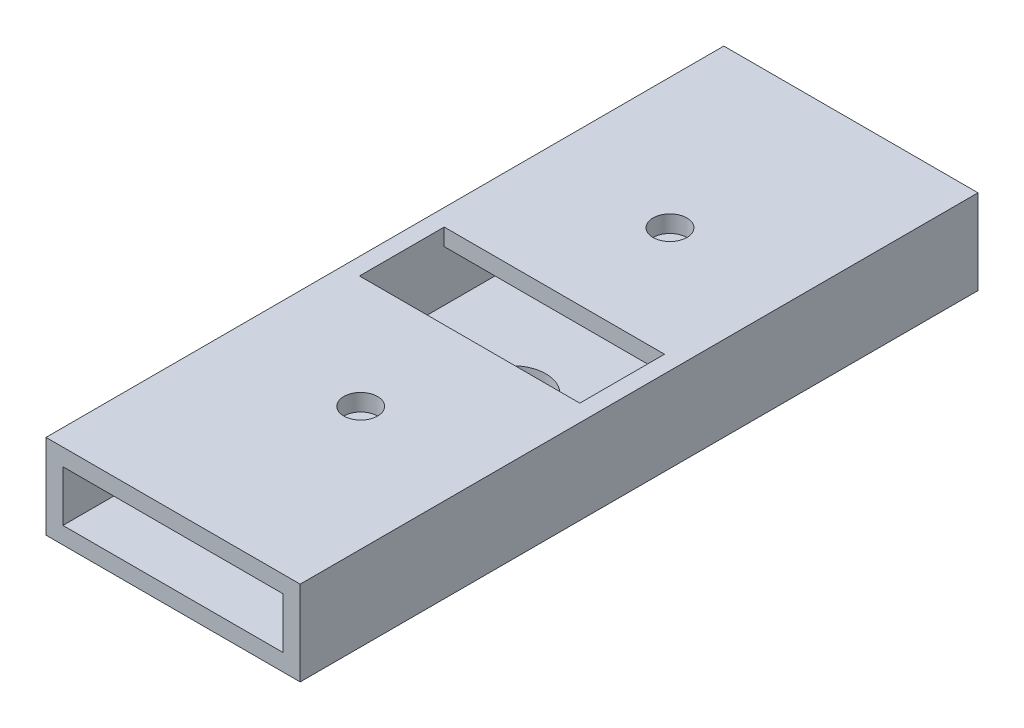
ISO-10303-21;
HEADER;
FILE_DESCRIPTION(('STEP AP214'),'2;1');
FILE_NAME('part.step','',(''),(''),'','','');
FILE_SCHEMA(('AUTOMOTIVE_DESIGN { 1 0 10303 214 1 1 1 1 }'));
ENDSEC;
DATA;
#1=APPLICATION_CONTEXT('core data for automotive mechanical design processes');
#2=APPLICATION_PROTOCOL_DEFINITION('international standard','automotive_design',2000,#1);
#3=PRODUCT_CONTEXT('',#1,'mechanical');
#4=PRODUCT('Part','Part','',(#3));
#5=PRODUCT_RELATED_PRODUCT_CATEGORY('part','',(#4));
#6=PRODUCT_DEFINITION_FORMATION('','',#4);
#7=PRODUCT_DEFINITION_CONTEXT('part definition',#1,'design');
#8=PRODUCT_DEFINITION('design','',#6,#7);
#9=PRODUCT_DEFINITION_SHAPE('','',#8);
#10=(LENGTH_UNIT() NAMED_UNIT(*) SI_UNIT(.MILLI.,.METRE.));
#11=(NAMED_UNIT(*) PLANE_ANGLE_UNIT() SI_UNIT($,.RADIAN.));
#12=(NAMED_UNIT(*) SI_UNIT($,.STERADIAN.) SOLID_ANGLE_UNIT());
#13=UNCERTAINTY_MEASURE_WITH_UNIT(LENGTH_MEASURE(1.E-05),#10,'distance_accuracy_value','');
#14=(GEOMETRIC_REPRESENTATION_CONTEXT(3) GLOBAL_UNCERTAINTY_ASSIGNED_CONTEXT((#13)) GLOBAL_UNIT_ASSIGNED_CONTEXT((#10,
#11,#12)) REPRESENTATION_CONTEXT('',''));
#15=CARTESIAN_POINT('',(0.,0.,0.));
#16=DIRECTION('',(0.,0.,1.));
#17=DIRECTION('',(1.,0.,0.));
#18=AXIS2_PLACEMENT_3D('',#15,#16,#17);
#19=CARTESIAN_POINT('',(0.,0.,80.));
#20=DIRECTION('',(0.,1.,0.));
#21=DIRECTION('',(0.,0.,1.));
#22=AXIS2_PLACEMENT_3D('',#19,#20,#21);
#23=PLANE('',#22);
#24=CARTESIAN_POINT('',(5.47,0.,40.));
#25=DIRECTION('',(0.,-1.,0.));
#26=DIRECTION('',(0.,0.,1.));
#27=AXIS2_PLACEMENT_3D('',#24,#25,#26);
#28=CIRCLE('',#27,1.25);
#29=CARTESIAN_POINT('',(5.47,0.,41.25));
#30=VERTEX_POINT('',#29);
#31=EDGE_CURVE('E600',#30,#30,#28,.T.);
#32=ORIENTED_EDGE('',*,*,#31,.F.);
#33=EDGE_LOOP('',(#32));
#34=FACE_BOUND('',#33,.T.);
#35=CARTESIAN_POINT('',(24.53,0.,40.));
#36=DIRECTION('',(0.,1.,0.));
#37=DIRECTION('',(0.,0.,1.));
#38=AXIS2_PLACEMENT_3D('',#35,#36,#37);
#39=CIRCLE('',#38,1.25);
#40=CARTESIAN_POINT('',(24.53,0.,41.25));
#41=VERTEX_POINT('',#40);
#42=EDGE_CURVE('E608',#41,#41,#39,.T.);
#43=ORIENTED_EDGE('',*,*,#42,.T.);
#44=EDGE_LOOP('',(#43));
#45=FACE_BOUND('',#44,.T.);
#46=DIRECTION('',(1.,0.,0.));
#47=VECTOR('',#46,1.);
#48=CARTESIAN_POINT('',(0.,0.,0.));
#49=LINE('',#48,#47);
#50=CARTESIAN_POINT('',(0.,0.,0.));
#51=VERTEX_POINT('',#50);
#52=CARTESIAN_POINT('',(30.,0.,0.));
#53=VERTEX_POINT('',#52);
#54=EDGE_CURVE('E216',#51,#53,#49,.T.);
#55=ORIENTED_EDGE('',*,*,#54,.T.);
#56=DIRECTION('',(0.,0.,-1.));
#57=VECTOR('',#56,1.);
#58=CARTESIAN_POINT('',(30.,0.,80.));
#59=LINE('',#58,#57);
#60=CARTESIAN_POINT('',(30.,0.,80.));
#61=VERTEX_POINT('',#60);
#62=EDGE_CURVE('E42',#61,#53,#59,.T.);
#63=ORIENTED_EDGE('',*,*,#62,.F.);
#64=DIRECTION('',(1.,0.,0.));
#65=VECTOR('',#64,1.);
#66=CARTESIAN_POINT('',(0.,0.,80.));
#67=LINE('',#66,#65);
#68=CARTESIAN_POINT('',(0.,0.,80.));
#69=VERTEX_POINT('',#68);
#70=EDGE_CURVE('E206',#69,#61,#67,.T.);
#71=ORIENTED_EDGE('',*,*,#70,.F.);
#72=DIRECTION('',(0.,0.,-1.));
#73=VECTOR('',#72,1.);
#74=CARTESIAN_POINT('',(0.,0.,80.));
#75=LINE('',#74,#73);
#76=EDGE_CURVE('E11',#69,#51,#75,.T.);
#77=ORIENTED_EDGE('',*,*,#76,.T.);
#78=EDGE_LOOP('',(#55,#63,#71,#77));
#79=FACE_BOUND('',#78,.T.);
#80=CARTESIAN_POINT('',(15.,0.,40.));
#81=DIRECTION('',(0.,1.,0.));
#82=DIRECTION('',(0.,0.,1.));
#83=AXIS2_PLACEMENT_3D('',#80,#81,#82);
#84=CIRCLE('',#83,4.);
#85=CARTESIAN_POINT('',(15.,0.,44.));
#86=VERTEX_POINT('',#85);
#87=EDGE_CURVE('E254',#86,#86,#84,.T.);
#88=ORIENTED_EDGE('',*,*,#87,.T.);
#89=EDGE_LOOP('',(#88));
#90=FACE_BOUND('',#89,.T.);
#91=DIRECTION('',(0.,0.,1.));
#92=VECTOR('',#91,1.);
#93=CARTESIAN_POINT('',(28.,0.,0.));
#94=LINE('',#93,#92);
#95=CARTESIAN_POINT('',(28.,0.,53.5));
#96=VERTEX_POINT('',#95);
#97=CARTESIAN_POINT('',(28.,0.,63.5));
#98=VERTEX_POINT('',#97);
#99=EDGE_CURVE('E260',#96,#98,#94,.T.);
#100=ORIENTED_EDGE('',*,*,#99,.F.);
#101=DIRECTION('',(1.,0.,0.));
#102=VECTOR('',#101,1.);
#103=CARTESIAN_POINT('',(0.,0.,53.5));
#104=LINE('',#103,#102);
#105=CARTESIAN_POINT('',(2.,0.,53.5));
#106=VERTEX_POINT('',#105);
#107=EDGE_CURVE('E284',#106,#96,#104,.T.);
#108=ORIENTED_EDGE('',*,*,#107,.F.);
#109=DIRECTION('',(0.,0.,1.));
#110=VECTOR('',#109,1.);
#111=CARTESIAN_POINT('',(2.00000000000001,0.,0.));
#112=LINE('',#111,#110);
#113=CARTESIAN_POINT('',(2.,0.,63.5));
#114=VERTEX_POINT('',#113);
#115=EDGE_CURVE('E290',#106,#114,#112,.T.);
#116=ORIENTED_EDGE('',*,*,#115,.T.);
#117=DIRECTION('',(1.,0.,0.));
#118=VECTOR('',#117,1.);
#119=CARTESIAN_POINT('',(0.,0.,63.5));
#120=LINE('',#119,#118);
#121=EDGE_CURVE('E296',#114,#98,#120,.T.);
#122=ORIENTED_EDGE('',*,*,#121,.T.);
#123=EDGE_LOOP('',(#100,#108,#116,#122));
#124=FACE_BOUND('',#123,.T.);
#125=DIRECTION('',(1.,0.,0.));
#126=VECTOR('',#125,1.);
#127=CARTESIAN_POINT('',(0.,0.,26.5));
#128=LINE('',#127,#126);
#129=CARTESIAN_POINT('',(2.,0.,26.5));
#130=VERTEX_POINT('',#129);
#131=CARTESIAN_POINT('',(28.,0.,26.5));
#132=VERTEX_POINT('',#131);
#133=EDGE_CURVE('E49',#130,#132,#128,.T.);
#134=ORIENTED_EDGE('',*,*,#133,.T.);
#135=DIRECTION('',(0.,0.,-1.));
#136=VECTOR('',#135,1.);
#137=CARTESIAN_POINT('',(28.,0.,80.));
#138=LINE('',#137,#136);
#139=CARTESIAN_POINT('',(28.,0.,16.5));
#140=VERTEX_POINT('',#139);
#141=EDGE_CURVE('E187',#132,#140,#138,.T.);
#142=ORIENTED_EDGE('',*,*,#141,.T.);
#143=DIRECTION('',(1.,0.,0.));
#144=VECTOR('',#143,1.);
#145=CARTESIAN_POINT('',(0.,0.,16.5));
#146=LINE('',#145,#144);
#147=CARTESIAN_POINT('',(2.,0.,16.5));
#148=VERTEX_POINT('',#147);
#149=EDGE_CURVE('E266',#148,#140,#146,.T.);
#150=ORIENTED_EDGE('',*,*,#149,.F.);
#151=DIRECTION('',(0.,0.,-1.));
#152=VECTOR('',#151,1.);
#153=CARTESIAN_POINT('',(2.00000000000001,0.,80.));
#154=LINE('',#153,#152);
#155=EDGE_CURVE('E263',#130,#148,#154,.T.);
#156=ORIENTED_EDGE('',*,*,#155,.F.);
#157=EDGE_LOOP('',(#134,#142,#150,#156));
#158=FACE_BOUND('',#157,.T.);
#159=ADVANCED_FACE('F34',(#34,#45,#79,#90,#124,#158),#23,.F.);
#160=CARTESIAN_POINT('',(2.,2.,80.));
#161=DIRECTION('',(0.,1.,0.));
#162=DIRECTION('',(0.,0.,1.));
#163=AXIS2_PLACEMENT_3D('',#160,#161,#162);
#164=PLANE('',#163);
#165=CARTESIAN_POINT('',(5.47,2.,40.));
#166=DIRECTION('',(0.,-1.,0.));
#167=DIRECTION('',(0.,0.,1.));
#168=AXIS2_PLACEMENT_3D('',#165,#166,#167);
#169=CIRCLE('',#168,1.25);
#170=CARTESIAN_POINT('',(5.47,2.,41.25));
#171=VERTEX_POINT('',#170);
#172=EDGE_CURVE('E603',#171,#171,#169,.T.);
#173=ORIENTED_EDGE('',*,*,#172,.T.);
#174=EDGE_LOOP('',(#173));
#175=FACE_BOUND('',#174,.T.);
#176=CARTESIAN_POINT('',(24.53,2.,40.));
#177=DIRECTION('',(0.,1.,0.));
#178=DIRECTION('',(0.,0.,1.));
#179=AXIS2_PLACEMENT_3D('',#176,#177,#178);
#180=CIRCLE('',#179,1.25);
#181=CARTESIAN_POINT('',(24.53,2.,41.25));
#182=VERTEX_POINT('',#181);
#183=EDGE_CURVE('E605',#182,#182,#180,.T.);
#184=ORIENTED_EDGE('',*,*,#183,.F.);
#185=EDGE_LOOP('',(#184));
#186=FACE_BOUND('',#185,.T.);
#187=CARTESIAN_POINT('',(15.,2.,40.));
#188=DIRECTION('',(0.,1.,0.));
#189=DIRECTION('',(0.,0.,1.));
#190=AXIS2_PLACEMENT_3D('',#187,#188,#189);
#191=CIRCLE('',#190,4.);
#192=CARTESIAN_POINT('',(15.,2.,44.));
#193=VERTEX_POINT('',#192);
#194=EDGE_CURVE('E334',#193,#193,#191,.T.);
#195=ORIENTED_EDGE('',*,*,#194,.F.);
#196=EDGE_LOOP('',(#195));
#197=FACE_BOUND('',#196,.T.);
#198=DIRECTION('',(0.,0.,-1.));
#199=VECTOR('',#198,1.);
#200=CARTESIAN_POINT('',(28.,2.,80.));
#201=LINE('',#200,#199);
#202=CARTESIAN_POINT('',(28.,2.,53.5));
#203=VERTEX_POINT('',#202);
#204=CARTESIAN_POINT('',(28.,2.,26.5));
#205=VERTEX_POINT('',#204);
#206=EDGE_CURVE('E186',#203,#205,#201,.T.);
#207=ORIENTED_EDGE('',*,*,#206,.T.);
#208=DIRECTION('',(1.,0.,0.));
#209=VECTOR('',#208,1.);
#210=CARTESIAN_POINT('',(0.,2.,26.5));
#211=LINE('',#210,#209);
#212=CARTESIAN_POINT('',(2.,2.,26.5));
#213=VERTEX_POINT('',#212);
#214=EDGE_CURVE('E172',#213,#205,#211,.T.);
#215=ORIENTED_EDGE('',*,*,#214,.F.);
#216=DIRECTION('',(0.,0.,-1.));
#217=VECTOR('',#216,1.);
#218=CARTESIAN_POINT('',(2.,2.,80.));
#219=LINE('',#218,#217);
#220=CARTESIAN_POINT('',(2.,2.,53.5));
#221=VERTEX_POINT('',#220);
#222=EDGE_CURVE('E185',#221,#213,#219,.T.);
#223=ORIENTED_EDGE('',*,*,#222,.F.);
#224=DIRECTION('',(1.,0.,0.));
#225=VECTOR('',#224,1.);
#226=CARTESIAN_POINT('',(0.,2.,53.5));
#227=LINE('',#226,#225);
#228=EDGE_CURVE('E287',#221,#203,#227,.T.);
#229=ORIENTED_EDGE('',*,*,#228,.T.);
#230=EDGE_LOOP('',(#207,#215,#223,#229));
#231=FACE_BOUND('',#230,.T.);
#232=ADVANCED_FACE('F183',(#175,#186,#197,#231),#164,.T.);
#233=CARTESIAN_POINT('',(28.,2.,80.));
#234=VERTEX_POINT('',#233);
#235=CARTESIAN_POINT('',(28.,2.,63.5));
#236=VERTEX_POINT('',#235);
#237=EDGE_CURVE('E199',#234,#236,#201,.T.);
#238=ORIENTED_EDGE('',*,*,#237,.T.);
#239=DIRECTION('',(1.,0.,0.));
#240=VECTOR('',#239,1.);
#241=CARTESIAN_POINT('',(0.,2.,63.5));
#242=LINE('',#241,#240);
#243=CARTESIAN_POINT('',(2.,2.,63.5));
#244=VERTEX_POINT('',#243);
#245=EDGE_CURVE('E289',#244,#236,#242,.T.);
#246=ORIENTED_EDGE('',*,*,#245,.F.);
#247=CARTESIAN_POINT('',(2.,2.,80.));
#248=VERTEX_POINT('',#247);
#249=EDGE_CURVE('E194',#248,#244,#219,.T.);
#250=ORIENTED_EDGE('',*,*,#249,.F.);
#251=DIRECTION('',(1.,0.,0.));
#252=VECTOR('',#251,1.);
#253=CARTESIAN_POINT('',(2.,2.,80.));
#254=LINE('',#253,#252);
#255=EDGE_CURVE('E340',#248,#234,#254,.T.);
#256=ORIENTED_EDGE('',*,*,#255,.T.);
#257=EDGE_LOOP('',(#238,#246,#250,#256));
#258=FACE_BOUND('',#257,.T.);
#259=ADVANCED_FACE('F402',(#258),#164,.T.);
#260=CARTESIAN_POINT('',(2.,8.,80.));
#261=DIRECTION('',(0.,-1.,0.));
#262=DIRECTION('',(0.,0.,-1.));
#263=AXIS2_PLACEMENT_3D('',#260,#261,#262);
#264=PLANE('',#263);
#265=CARTESIAN_POINT('',(15.3919520849994,8.,58.25));
#266=DIRECTION('',(0.,-1.,0.));
#267=DIRECTION('',(0.,0.,-1.));
#268=AXIS2_PLACEMENT_3D('',#265,#266,#267);
#269=CIRCLE('',#268,2.);
#270=CARTESIAN_POINT('',(15.3919520849994,8.,56.25));
#271=VERTEX_POINT('',#270);
#272=EDGE_CURVE('E277',#271,#271,#269,.T.);
#273=ORIENTED_EDGE('',*,*,#272,.F.);
#274=EDGE_LOOP('',(#273));
#275=FACE_BOUND('',#274,.T.);
#276=DIRECTION('',(1.,0.,0.));
#277=VECTOR('',#276,1.);
#278=CARTESIAN_POINT('',(1.99999999999999,8.,45.));
#279=LINE('',#278,#277);
#280=CARTESIAN_POINT('',(1.99999999999999,8.,45.));
#281=VERTEX_POINT('',#280);
#282=CARTESIAN_POINT('',(28.,8.,45.));
#283=VERTEX_POINT('',#282);
#284=EDGE_CURVE('E311',#281,#283,#279,.T.);
#285=ORIENTED_EDGE('',*,*,#284,.T.);
#286=DIRECTION('',(0.,0.,-1.));
#287=VECTOR('',#286,1.);
#288=CARTESIAN_POINT('',(28.,8.,80.));
#289=LINE('',#288,#287);
#290=CARTESIAN_POINT('',(28.,8.,80.));
#291=VERTEX_POINT('',#290);
#292=EDGE_CURVE('E362',#291,#283,#289,.T.);
#293=ORIENTED_EDGE('',*,*,#292,.F.);
#294=DIRECTION('',(-1.,0.,0.));
#295=VECTOR('',#294,1.);
#296=CARTESIAN_POINT('',(2.,8.,80.));
#297=LINE('',#296,#295);
#298=CARTESIAN_POINT('',(2.,8.,80.));
#299=VERTEX_POINT('',#298);
#300=EDGE_CURVE('E346',#291,#299,#297,.T.);
#301=ORIENTED_EDGE('',*,*,#300,.T.);
#302=DIRECTION('',(0.,0.,-1.));
#303=VECTOR('',#302,1.);
#304=CARTESIAN_POINT('',(2.,8.,80.));
#305=LINE('',#304,#303);
#306=EDGE_CURVE('E359',#299,#281,#305,.T.);
#307=ORIENTED_EDGE('',*,*,#306,.T.);
#308=EDGE_LOOP('',(#285,#293,#301,#307));
#309=FACE_BOUND('',#308,.T.);
#310=ADVANCED_FACE('F429',(#275,#309),#264,.T.);
#311=CARTESIAN_POINT('',(0.,0.,80.));
#312=DIRECTION('',(0.,0.,-1.));
#313=DIRECTION('',(-1.,0.,0.));
#314=AXIS2_PLACEMENT_3D('',#311,#312,#313);
#315=PLANE('',#314);
#316=DIRECTION('',(0.,-1.,0.));
#317=VECTOR('',#316,1.);
#318=CARTESIAN_POINT('',(0.,0.,80.));
#319=LINE('',#318,#317);
#320=CARTESIAN_POINT('',(0.,10.,80.));
#321=VERTEX_POINT('',#320);
#322=EDGE_CURVE('E203',#321,#69,#319,.T.);
#323=ORIENTED_EDGE('',*,*,#322,.T.);
#324=ORIENTED_EDGE('',*,*,#70,.T.);
#325=DIRECTION('',(0.,1.,0.));
#326=VECTOR('',#325,1.);
#327=CARTESIAN_POINT('',(30.,0.,80.));
#328=LINE('',#327,#326);
#329=CARTESIAN_POINT('',(30.,10.,80.));
#330=VERTEX_POINT('',#329);
#331=EDGE_CURVE('E209',#61,#330,#328,.T.);
#332=ORIENTED_EDGE('',*,*,#331,.T.);
#333=DIRECTION('',(-1.,0.,0.));
#334=VECTOR('',#333,1.);
#335=CARTESIAN_POINT('',(0.,10.,80.));
#336=LINE('',#335,#334);
#337=EDGE_CURVE('E211',#330,#321,#336,.T.);
#338=ORIENTED_EDGE('',*,*,#337,.T.);
#339=EDGE_LOOP('',(#323,#324,#332,#338));
#340=FACE_BOUND('',#339,.T.);
#341=DIRECTION('',(0.,-1.,0.));
#342=VECTOR('',#341,1.);
#343=CARTESIAN_POINT('',(2.,2.,80.));
#344=LINE('',#343,#342);
#345=EDGE_CURVE('E338',#299,#248,#344,.T.);
#346=ORIENTED_EDGE('',*,*,#345,.F.);
#347=ORIENTED_EDGE('',*,*,#300,.F.);
#348=DIRECTION('',(0.,1.,0.));
#349=VECTOR('',#348,1.);
#350=CARTESIAN_POINT('',(28.,2.,80.));
#351=LINE('',#350,#349);
#352=EDGE_CURVE('E343',#234,#291,#351,.T.);
#353=ORIENTED_EDGE('',*,*,#352,.F.);
#354=ORIENTED_EDGE('',*,*,#255,.F.);
#355=EDGE_LOOP('',(#346,#347,#353,#354));
#356=FACE_BOUND('',#355,.T.);
#357=ADVANCED_FACE('F246',(#340,#356),#315,.F.);
#358=CARTESIAN_POINT('',(0.,0.,0.));
#359=DIRECTION('',(0.,0.,-1.));
#360=DIRECTION('',(-1.,0.,0.));
#361=AXIS2_PLACEMENT_3D('',#358,#359,#360);
#362=PLANE('',#361);
#363=DIRECTION('',(0.,-1.,0.));
#364=VECTOR('',#363,1.);
#365=CARTESIAN_POINT('',(0.,0.,0.));
#366=LINE('',#365,#364);
#367=CARTESIAN_POINT('',(0.,10.,0.));
#368=VERTEX_POINT('',#367);
#369=EDGE_CURVE('E198',#368,#51,#366,.T.);
#370=ORIENTED_EDGE('',*,*,#369,.F.);
#371=DIRECTION('',(-1.,0.,0.));
#372=VECTOR('',#371,1.);
#373=CARTESIAN_POINT('',(0.,10.,0.));
#374=LINE('',#373,#372);
#375=CARTESIAN_POINT('',(30.,10.,0.));
#376=VERTEX_POINT('',#375);
#377=EDGE_CURVE('E207',#376,#368,#374,.T.);
#378=ORIENTED_EDGE('',*,*,#377,.F.);
#379=DIRECTION('',(0.,1.,0.));
#380=VECTOR('',#379,1.);
#381=CARTESIAN_POINT('',(30.,0.,0.));
#382=LINE('',#381,#380);
#383=EDGE_CURVE('E218',#53,#376,#382,.T.);
#384=ORIENTED_EDGE('',*,*,#383,.F.);
#385=ORIENTED_EDGE('',*,*,#54,.F.);
#386=EDGE_LOOP('',(#370,#378,#384,#385));
#387=FACE_BOUND('',#386,.T.);
#388=DIRECTION('',(-1.,0.,0.));
#389=VECTOR('',#388,1.);
#390=CARTESIAN_POINT('',(2.,8.,0.));
#391=LINE('',#390,#389);
#392=CARTESIAN_POINT('',(28.,8.,0.));
#393=VERTEX_POINT('',#392);
#394=CARTESIAN_POINT('',(2.,8.,0.));
#395=VERTEX_POINT('',#394);
#396=EDGE_CURVE('E341',#393,#395,#391,.T.);
#397=ORIENTED_EDGE('',*,*,#396,.T.);
#398=DIRECTION('',(0.,-1.,0.));
#399=VECTOR('',#398,1.);
#400=CARTESIAN_POINT('',(2.,2.,0.));
#401=LINE('',#400,#399);
#402=CARTESIAN_POINT('',(2.,2.,0.));
#403=VERTEX_POINT('',#402);
#404=EDGE_CURVE('E337',#395,#403,#401,.T.);
#405=ORIENTED_EDGE('',*,*,#404,.T.);
#406=DIRECTION('',(1.,0.,0.));
#407=VECTOR('',#406,1.);
#408=CARTESIAN_POINT('',(2.,2.,0.));
#409=LINE('',#408,#407);
#410=CARTESIAN_POINT('',(28.,2.,0.));
#411=VERTEX_POINT('',#410);
#412=EDGE_CURVE('E351',#403,#411,#409,.T.);
#413=ORIENTED_EDGE('',*,*,#412,.T.);
#414=DIRECTION('',(0.,1.,0.));
#415=VECTOR('',#414,1.);
#416=CARTESIAN_POINT('',(28.,2.,0.));
#417=LINE('',#416,#415);
#418=EDGE_CURVE('E354',#411,#393,#417,.T.);
#419=ORIENTED_EDGE('',*,*,#418,.T.);
#420=EDGE_LOOP('',(#397,#405,#413,#419));
#421=FACE_BOUND('',#420,.T.);
#422=ADVANCED_FACE('F236',(#387,#421),#362,.T.);
#423=CARTESIAN_POINT('',(0.,0.,80.));
#424=DIRECTION('',(1.,0.,0.));
#425=DIRECTION('',(0.,0.,-1.));
#426=AXIS2_PLACEMENT_3D('',#423,#424,#425);
#427=PLANE('',#426);
#428=ORIENTED_EDGE('',*,*,#369,.T.);
#429=ORIENTED_EDGE('',*,*,#76,.F.);
#430=ORIENTED_EDGE('',*,*,#322,.F.);
#431=DIRECTION('',(0.,0.,-1.));
#432=VECTOR('',#431,1.);
#433=CARTESIAN_POINT('',(0.,10.,80.));
#434=LINE('',#433,#432);
#435=EDGE_CURVE('E213',#321,#368,#434,.T.);
#436=ORIENTED_EDGE('',*,*,#435,.T.);
#437=EDGE_LOOP('',(#428,#429,#430,#436));
#438=FACE_BOUND('',#437,.T.);
#439=ADVANCED_FACE('F36',(#438),#427,.F.);
#440=CARTESIAN_POINT('',(30.,0.,80.));
#441=DIRECTION('',(-1.,0.,0.));
#442=DIRECTION('',(0.,0.,1.));
#443=AXIS2_PLACEMENT_3D('',#440,#441,#442);
#444=PLANE('',#443);
#445=ORIENTED_EDGE('',*,*,#383,.T.);
#446=DIRECTION('',(0.,0.,-1.));
#447=VECTOR('',#446,1.);
#448=CARTESIAN_POINT('',(30.,10.,80.));
#449=LINE('',#448,#447);
#450=EDGE_CURVE('E223',#330,#376,#449,.T.);
#451=ORIENTED_EDGE('',*,*,#450,.F.);
#452=ORIENTED_EDGE('',*,*,#331,.F.);
#453=ORIENTED_EDGE('',*,*,#62,.T.);
#454=EDGE_LOOP('',(#445,#451,#452,#453));
#455=FACE_BOUND('',#454,.T.);
#456=ADVANCED_FACE('F230',(#455),#444,.F.);
#457=CARTESIAN_POINT('',(0.,10.,80.));
#458=DIRECTION('',(0.,-1.,0.));
#459=DIRECTION('',(0.,0.,-1.));
#460=AXIS2_PLACEMENT_3D('',#457,#458,#459);
#461=PLANE('',#460);
#462=CARTESIAN_POINT('',(15.3919520849994,10.,21.75));
#463=DIRECTION('',(0.,1.,0.));
#464=DIRECTION('',(0.,0.,1.));
#465=AXIS2_PLACEMENT_3D('',#462,#463,#464);
#466=CIRCLE('',#465,2.);
#467=CARTESIAN_POINT('',(15.3919520849994,10.,23.75));
#468=VERTEX_POINT('',#467);
#469=EDGE_CURVE('E264',#468,#468,#466,.T.);
#470=ORIENTED_EDGE('',*,*,#469,.F.);
#471=EDGE_LOOP('',(#470));
#472=FACE_BOUND('',#471,.T.);
#473=CARTESIAN_POINT('',(15.3919520849994,10.,58.25));
#474=DIRECTION('',(0.,-1.,0.));
#475=DIRECTION('',(0.,0.,-1.));
#476=AXIS2_PLACEMENT_3D('',#473,#474,#475);
#477=CIRCLE('',#476,2.);
#478=CARTESIAN_POINT('',(15.3919520849994,10.,56.25));
#479=VERTEX_POINT('',#478);
#480=EDGE_CURVE('E281',#479,#479,#477,.T.);
#481=ORIENTED_EDGE('',*,*,#480,.T.);
#482=EDGE_LOOP('',(#481));
#483=FACE_BOUND('',#482,.T.);
#484=DIRECTION('',(-1.,0.,0.));
#485=VECTOR('',#484,1.);
#486=CARTESIAN_POINT('',(1.99999999999999,10.,35.));
#487=LINE('',#486,#485);
#488=CARTESIAN_POINT('',(28.,10.,35.));
#489=VERTEX_POINT('',#488);
#490=CARTESIAN_POINT('',(1.99999999999999,10.,35.));
#491=VERTEX_POINT('',#490);
#492=EDGE_CURVE('E317',#489,#491,#487,.T.);
#493=ORIENTED_EDGE('',*,*,#492,.F.);
#494=DIRECTION('',(0.,0.,-1.));
#495=VECTOR('',#494,1.);
#496=CARTESIAN_POINT('',(28.,10.,45.));
#497=LINE('',#496,#495);
#498=CARTESIAN_POINT('',(28.,10.,45.));
#499=VERTEX_POINT('',#498);
#500=EDGE_CURVE('E301',#499,#489,#497,.T.);
#501=ORIENTED_EDGE('',*,*,#500,.F.);
#502=DIRECTION('',(1.,0.,0.));
#503=VECTOR('',#502,1.);
#504=CARTESIAN_POINT('',(1.99999999999999,10.,45.));
#505=LINE('',#504,#503);
#506=CARTESIAN_POINT('',(1.99999999999999,10.,45.));
#507=VERTEX_POINT('',#506);
#508=EDGE_CURVE('E312',#507,#499,#505,.T.);
#509=ORIENTED_EDGE('',*,*,#508,.F.);
#510=DIRECTION('',(0.,0.,1.));
#511=VECTOR('',#510,1.);
#512=CARTESIAN_POINT('',(1.99999999999999,10.,45.));
#513=LINE('',#512,#511);
#514=EDGE_CURVE('E320',#491,#507,#513,.T.);
#515=ORIENTED_EDGE('',*,*,#514,.F.);
#516=EDGE_LOOP('',(#493,#501,#509,#515));
#517=FACE_BOUND('',#516,.T.);
#518=ORIENTED_EDGE('',*,*,#377,.T.);
#519=ORIENTED_EDGE('',*,*,#435,.F.);
#520=ORIENTED_EDGE('',*,*,#337,.F.);
#521=ORIENTED_EDGE('',*,*,#450,.T.);
#522=EDGE_LOOP('',(#518,#519,#520,#521));
#523=FACE_BOUND('',#522,.T.);
#524=ADVANCED_FACE('F240',(#472,#483,#517,#523),#461,.F.);
#525=CARTESIAN_POINT('',(2.,2.,80.));
#526=DIRECTION('',(1.,0.,0.));
#527=DIRECTION('',(0.,1.,0.));
#528=AXIS2_PLACEMENT_3D('',#525,#526,#527);
#529=PLANE('',#528);
#530=ORIENTED_EDGE('',*,*,#404,.F.);
#531=CARTESIAN_POINT('',(2.,8.,35.));
#532=VERTEX_POINT('',#531);
#533=EDGE_CURVE('E348',#532,#395,#305,.T.);
#534=ORIENTED_EDGE('',*,*,#533,.F.);
#535=DIRECTION('',(0.,1.,0.));
#536=VECTOR('',#535,1.);
#537=CARTESIAN_POINT('',(1.99999999999999,8.,35.));
#538=LINE('',#537,#536);
#539=EDGE_CURVE('E329',#532,#491,#538,.T.);
#540=ORIENTED_EDGE('',*,*,#539,.T.);
#541=ORIENTED_EDGE('',*,*,#514,.T.);
#542=DIRECTION('',(0.,1.,0.));
#543=VECTOR('',#542,1.);
#544=CARTESIAN_POINT('',(1.99999999999999,8.,45.));
#545=LINE('',#544,#543);
#546=EDGE_CURVE('E327',#281,#507,#545,.T.);
#547=ORIENTED_EDGE('',*,*,#546,.F.);
#548=ORIENTED_EDGE('',*,*,#306,.F.);
#549=ORIENTED_EDGE('',*,*,#345,.T.);
#550=ORIENTED_EDGE('',*,*,#249,.T.);
#551=DIRECTION('',(0.,-1.,0.));
#552=VECTOR('',#551,1.);
#553=CARTESIAN_POINT('',(2.,2.,63.5));
#554=LINE('',#553,#552);
#555=EDGE_CURVE('E302',#244,#114,#554,.T.);
#556=ORIENTED_EDGE('',*,*,#555,.T.);
#557=ORIENTED_EDGE('',*,*,#115,.F.);
#558=DIRECTION('',(0.,-1.,0.));
#559=VECTOR('',#558,1.);
#560=CARTESIAN_POINT('',(2.,2.,53.5));
#561=LINE('',#560,#559);
#562=EDGE_CURVE('E192',#221,#106,#561,.T.);
#563=ORIENTED_EDGE('',*,*,#562,.F.);
#564=ORIENTED_EDGE('',*,*,#222,.T.);
#565=DIRECTION('',(0.,-1.,0.));
#566=VECTOR('',#565,1.);
#567=CARTESIAN_POINT('',(2.,2.,26.5));
#568=LINE('',#567,#566);
#569=EDGE_CURVE('E169',#213,#130,#568,.T.);
#570=ORIENTED_EDGE('',*,*,#569,.T.);
#571=ORIENTED_EDGE('',*,*,#155,.T.);
#572=DIRECTION('',(0.,-1.,0.));
#573=VECTOR('',#572,1.);
#574=CARTESIAN_POINT('',(2.,2.,16.5));
#575=LINE('',#574,#573);
#576=CARTESIAN_POINT('',(2.,2.,16.5));
#577=VERTEX_POINT('',#576);
#578=EDGE_CURVE('E178',#577,#148,#575,.T.);
#579=ORIENTED_EDGE('',*,*,#578,.F.);
#580=EDGE_CURVE('E195',#577,#403,#219,.T.);
#581=ORIENTED_EDGE('',*,*,#580,.T.);
#582=EDGE_LOOP('',(#530,#534,#540,#541,#547,#548,#549,#550,#556,#557,#563,#564,#570,#571,#579,#581));
#583=FACE_BOUND('',#582,.T.);
#584=ADVANCED_FACE('F190',(#583),#529,.T.);
#585=DIRECTION('',(1.,0.,0.));
#586=VECTOR('',#585,1.);
#587=CARTESIAN_POINT('',(0.,2.,16.5));
#588=LINE('',#587,#586);
#589=CARTESIAN_POINT('',(28.,2.,16.5));
#590=VERTEX_POINT('',#589);
#591=EDGE_CURVE('E179',#577,#590,#588,.T.);
#592=ORIENTED_EDGE('',*,*,#591,.T.);
#593=EDGE_CURVE('E364',#590,#411,#201,.T.);
#594=ORIENTED_EDGE('',*,*,#593,.T.);
#595=ORIENTED_EDGE('',*,*,#412,.F.);
#596=ORIENTED_EDGE('',*,*,#580,.F.);
#597=EDGE_LOOP('',(#592,#594,#595,#596));
#598=FACE_BOUND('',#597,.T.);
#599=ADVANCED_FACE('F378',(#598),#164,.T.);
#600=CARTESIAN_POINT('',(28.,2.,80.));
#601=DIRECTION('',(-1.,0.,0.));
#602=DIRECTION('',(0.,-1.,0.));
#603=AXIS2_PLACEMENT_3D('',#600,#601,#602);
#604=PLANE('',#603);
#605=ORIENTED_EDGE('',*,*,#418,.F.);
#606=ORIENTED_EDGE('',*,*,#593,.F.);
#607=DIRECTION('',(0.,-1.,0.));
#608=VECTOR('',#607,1.);
#609=CARTESIAN_POINT('',(28.,2.,16.5));
#610=LINE('',#609,#608);
#611=EDGE_CURVE('E278',#590,#140,#610,.T.);
#612=ORIENTED_EDGE('',*,*,#611,.T.);
#613=ORIENTED_EDGE('',*,*,#141,.F.);
#614=DIRECTION('',(0.,-1.,0.));
#615=VECTOR('',#614,1.);
#616=CARTESIAN_POINT('',(28.,2.,26.5));
#617=LINE('',#616,#615);
#618=EDGE_CURVE('E56',#205,#132,#617,.T.);
#619=ORIENTED_EDGE('',*,*,#618,.F.);
#620=ORIENTED_EDGE('',*,*,#206,.F.);
#621=DIRECTION('',(0.,-1.,0.));
#622=VECTOR('',#621,1.);
#623=CARTESIAN_POINT('',(28.,2.,53.5));
#624=LINE('',#623,#622);
#625=EDGE_CURVE('E293',#203,#96,#624,.T.);
#626=ORIENTED_EDGE('',*,*,#625,.T.);
#627=ORIENTED_EDGE('',*,*,#99,.T.);
#628=DIRECTION('',(0.,-1.,0.));
#629=VECTOR('',#628,1.);
#630=CARTESIAN_POINT('',(28.,2.,63.5));
#631=LINE('',#630,#629);
#632=EDGE_CURVE('E304',#236,#98,#631,.T.);
#633=ORIENTED_EDGE('',*,*,#632,.F.);
#634=ORIENTED_EDGE('',*,*,#237,.F.);
#635=ORIENTED_EDGE('',*,*,#352,.T.);
#636=ORIENTED_EDGE('',*,*,#292,.T.);
#637=DIRECTION('',(0.,1.,0.));
#638=VECTOR('',#637,1.);
#639=CARTESIAN_POINT('',(28.,8.,45.));
#640=LINE('',#639,#638);
#641=EDGE_CURVE('E325',#283,#499,#640,.T.);
#642=ORIENTED_EDGE('',*,*,#641,.T.);
#643=ORIENTED_EDGE('',*,*,#500,.T.);
#644=DIRECTION('',(0.,1.,0.));
#645=VECTOR('',#644,1.);
#646=CARTESIAN_POINT('',(28.,8.,35.));
#647=LINE('',#646,#645);
#648=CARTESIAN_POINT('',(28.,8.,35.));
#649=VERTEX_POINT('',#648);
#650=EDGE_CURVE('E315',#649,#489,#647,.T.);
#651=ORIENTED_EDGE('',*,*,#650,.F.);
#652=EDGE_CURVE('E361',#649,#393,#289,.T.);
#653=ORIENTED_EDGE('',*,*,#652,.T.);
#654=EDGE_LOOP('',(#605,#606,#612,#613,#619,#620,#626,#627,#633,#634,#635,#636,#642,#643,#651,#653));
#655=FACE_BOUND('',#654,.T.);
#656=ADVANCED_FACE('F368',(#655),#604,.T.);
#657=CARTESIAN_POINT('',(15.3919520849994,8.,21.75));
#658=DIRECTION('',(0.,1.,0.));
#659=DIRECTION('',(0.,0.,1.));
#660=AXIS2_PLACEMENT_3D('',#657,#658,#659);
#661=CIRCLE('',#660,2.);
#662=CARTESIAN_POINT('',(15.3919520849994,8.,23.75));
#663=VERTEX_POINT('',#662);
#664=EDGE_CURVE('E269',#663,#663,#661,.T.);
#665=ORIENTED_EDGE('',*,*,#664,.T.);
#666=EDGE_LOOP('',(#665));
#667=FACE_BOUND('',#666,.T.);
#668=DIRECTION('',(-1.,0.,0.));
#669=VECTOR('',#668,1.);
#670=CARTESIAN_POINT('',(1.99999999999999,8.,35.));
#671=LINE('',#670,#669);
#672=EDGE_CURVE('E308',#649,#532,#671,.T.);
#673=ORIENTED_EDGE('',*,*,#672,.T.);
#674=ORIENTED_EDGE('',*,*,#533,.T.);
#675=ORIENTED_EDGE('',*,*,#396,.F.);
#676=ORIENTED_EDGE('',*,*,#652,.F.);
#677=EDGE_LOOP('',(#673,#674,#675,#676));
#678=FACE_BOUND('',#677,.T.);
#679=ADVANCED_FACE('F372',(#667,#678),#264,.T.);
#680=CARTESIAN_POINT('',(15.,0.,40.));
#681=DIRECTION('',(0.,1.,0.));
#682=DIRECTION('',(0.,0.,1.));
#683=AXIS2_PLACEMENT_3D('',#680,#681,#682);
#684=CYLINDRICAL_SURFACE('',#683,4.);
#685=ORIENTED_EDGE('',*,*,#194,.T.);
#686=EDGE_LOOP('',(#685));
#687=FACE_BOUND('',#686,.T.);
#688=ORIENTED_EDGE('',*,*,#87,.F.);
#689=EDGE_LOOP('',(#688));
#690=FACE_BOUND('',#689,.T.);
#691=ADVANCED_FACE('F421',(#687,#690),#684,.F.);
#692=CARTESIAN_POINT('',(1.99999999999999,8.,45.));
#693=DIRECTION('',(0.,0.,1.));
#694=DIRECTION('',(1.,0.,0.));
#695=AXIS2_PLACEMENT_3D('',#692,#693,#694);
#696=PLANE('',#695);
#697=ORIENTED_EDGE('',*,*,#508,.T.);
#698=ORIENTED_EDGE('',*,*,#641,.F.);
#699=ORIENTED_EDGE('',*,*,#284,.F.);
#700=ORIENTED_EDGE('',*,*,#546,.T.);
#701=EDGE_LOOP('',(#697,#698,#699,#700));
#702=FACE_BOUND('',#701,.T.);
#703=ADVANCED_FACE('F390',(#702),#696,.F.);
#704=CARTESIAN_POINT('',(1.99999999999999,8.,35.));
#705=DIRECTION('',(0.,0.,-1.));
#706=DIRECTION('',(-1.,0.,0.));
#707=AXIS2_PLACEMENT_3D('',#704,#705,#706);
#708=PLANE('',#707);
#709=ORIENTED_EDGE('',*,*,#492,.T.);
#710=ORIENTED_EDGE('',*,*,#539,.F.);
#711=ORIENTED_EDGE('',*,*,#672,.F.);
#712=ORIENTED_EDGE('',*,*,#650,.T.);
#713=EDGE_LOOP('',(#709,#710,#711,#712));
#714=FACE_BOUND('',#713,.T.);
#715=ADVANCED_FACE('F386',(#714),#708,.F.);
#716=CARTESIAN_POINT('',(0.,2.,53.5));
#717=DIRECTION('',(0.,0.,-1.));
#718=DIRECTION('',(-1.,0.,0.));
#719=AXIS2_PLACEMENT_3D('',#716,#717,#718);
#720=PLANE('',#719);
#721=ORIENTED_EDGE('',*,*,#107,.T.);
#722=ORIENTED_EDGE('',*,*,#625,.F.);
#723=ORIENTED_EDGE('',*,*,#228,.F.);
#724=ORIENTED_EDGE('',*,*,#562,.T.);
#725=EDGE_LOOP('',(#721,#722,#723,#724));
#726=FACE_BOUND('',#725,.T.);
#727=ADVANCED_FACE('F408',(#726),#720,.F.);
#728=CARTESIAN_POINT('',(0.,2.,63.5));
#729=DIRECTION('',(0.,0.,-1.));
#730=DIRECTION('',(-1.,0.,0.));
#731=AXIS2_PLACEMENT_3D('',#728,#729,#730);
#732=PLANE('',#731);
#733=ORIENTED_EDGE('',*,*,#121,.F.);
#734=ORIENTED_EDGE('',*,*,#555,.F.);
#735=ORIENTED_EDGE('',*,*,#245,.T.);
#736=ORIENTED_EDGE('',*,*,#632,.T.);
#737=EDGE_LOOP('',(#733,#734,#735,#736));
#738=FACE_BOUND('',#737,.T.);
#739=ADVANCED_FACE('F406',(#738),#732,.T.);
#740=CARTESIAN_POINT('',(15.3919520849994,10.,58.25));
#741=DIRECTION('',(0.,-1.,0.));
#742=DIRECTION('',(0.,0.,-1.));
#743=AXIS2_PLACEMENT_3D('',#740,#741,#742);
#744=CYLINDRICAL_SURFACE('',#743,2.);
#745=ORIENTED_EDGE('',*,*,#480,.F.);
#746=EDGE_LOOP('',(#745));
#747=FACE_BOUND('',#746,.T.);
#748=ORIENTED_EDGE('',*,*,#272,.T.);
#749=EDGE_LOOP('',(#748));
#750=FACE_BOUND('',#749,.T.);
#751=ADVANCED_FACE('F415',(#747,#750),#744,.F.);
#752=CARTESIAN_POINT('',(0.,2.,26.5));
#753=DIRECTION('',(0.,0.,-1.));
#754=DIRECTION('',(-1.,0.,0.));
#755=AXIS2_PLACEMENT_3D('',#752,#753,#754);
#756=PLANE('',#755);
#757=ORIENTED_EDGE('',*,*,#133,.F.);
#758=ORIENTED_EDGE('',*,*,#569,.F.);
#759=ORIENTED_EDGE('',*,*,#214,.T.);
#760=ORIENTED_EDGE('',*,*,#618,.T.);
#761=EDGE_LOOP('',(#757,#758,#759,#760));
#762=FACE_BOUND('',#761,.T.);
#763=ADVANCED_FACE('F171',(#762),#756,.T.);
#764=CARTESIAN_POINT('',(0.,2.,16.5));
#765=DIRECTION('',(0.,0.,-1.));
#766=DIRECTION('',(-1.,0.,0.));
#767=AXIS2_PLACEMENT_3D('',#764,#765,#766);
#768=PLANE('',#767);
#769=ORIENTED_EDGE('',*,*,#149,.T.);
#770=ORIENTED_EDGE('',*,*,#611,.F.);
#771=ORIENTED_EDGE('',*,*,#591,.F.);
#772=ORIENTED_EDGE('',*,*,#578,.T.);
#773=EDGE_LOOP('',(#769,#770,#771,#772));
#774=FACE_BOUND('',#773,.T.);
#775=ADVANCED_FACE('F381',(#774),#768,.F.);
#776=CARTESIAN_POINT('',(15.3919520849994,10.,21.75));
#777=DIRECTION('',(0.,-1.,0.));
#778=DIRECTION('',(0.,0.,-1.));
#779=AXIS2_PLACEMENT_3D('',#776,#777,#778);
#780=CYLINDRICAL_SURFACE('',#779,2.);
#781=ORIENTED_EDGE('',*,*,#469,.T.);
#782=EDGE_LOOP('',(#781));
#783=FACE_BOUND('',#782,.T.);
#784=ORIENTED_EDGE('',*,*,#664,.F.);
#785=EDGE_LOOP('',(#784));
#786=FACE_BOUND('',#785,.T.);
#787=ADVANCED_FACE('F556',(#783,#786),#780,.F.);
#788=CARTESIAN_POINT('',(24.53,0.,40.));
#789=DIRECTION('',(0.,1.,0.));
#790=DIRECTION('',(0.,0.,1.));
#791=AXIS2_PLACEMENT_3D('',#788,#789,#790);
#792=CYLINDRICAL_SURFACE('',#791,1.25);
#793=ORIENTED_EDGE('',*,*,#42,.F.);
#794=EDGE_LOOP('',(#793));
#795=FACE_BOUND('',#794,.T.);
#796=ORIENTED_EDGE('',*,*,#183,.T.);
#797=EDGE_LOOP('',(#796));
#798=FACE_BOUND('',#797,.T.);
#799=ADVANCED_FACE('F565',(#795,#798),#792,.F.);
#800=CARTESIAN_POINT('',(5.47,0.,40.));
#801=DIRECTION('',(0.,1.,0.));
#802=DIRECTION('',(0.,0.,1.));
#803=AXIS2_PLACEMENT_3D('',#800,#801,#802);
#804=CYLINDRICAL_SURFACE('',#803,1.25);
#805=ORIENTED_EDGE('',*,*,#31,.T.);
#806=EDGE_LOOP('',(#805));
#807=FACE_BOUND('',#806,.T.);
#808=ORIENTED_EDGE('',*,*,#172,.F.);
#809=EDGE_LOOP('',(#808));
#810=FACE_BOUND('',#809,.T.);
#811=ADVANCED_FACE('F574',(#807,#810),#804,.F.);
#812=CLOSED_SHELL('',(#159,#232,#259,#310,#357,#422,#439,#456,#524,#584,#599,#656,#679,#691,
#703,#715,#727,#739,#751,#763,#775,#787,#799,#811));
#813=MANIFOLD_SOLID_BREP('B2',#812);
#814=ADVANCED_BREP_SHAPE_REPRESENTATION('',(#18,#813),#14);
#815=SHAPE_DEFINITION_REPRESENTATION(#9,#814);
ENDSEC;
END-ISO-10303-21;
